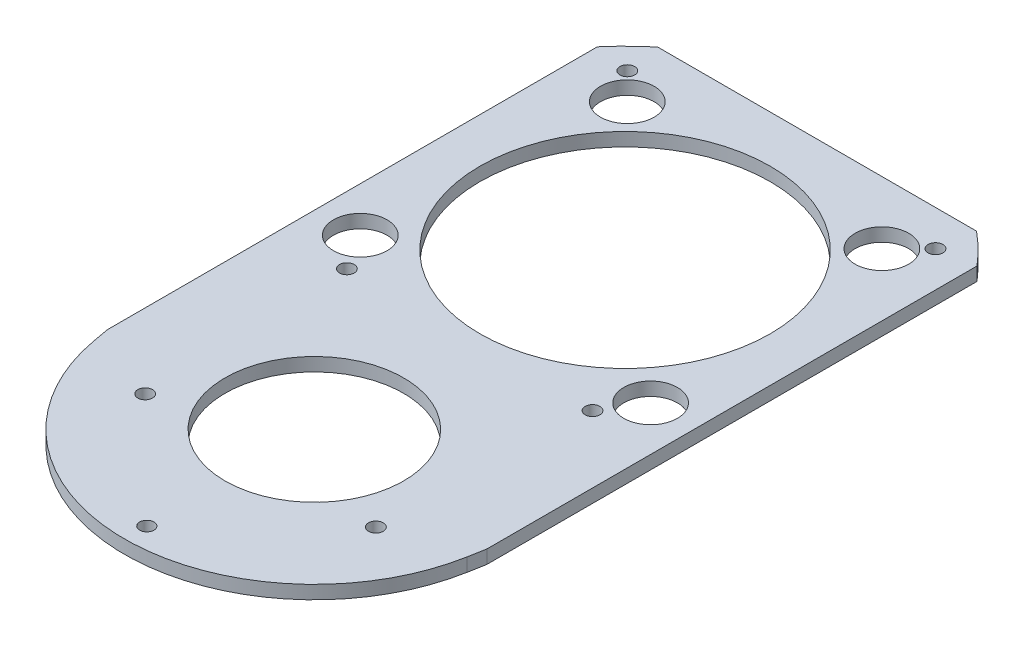
ISO-10303-21;
HEADER;
FILE_DESCRIPTION(('STEP AP214'),'2;1');
FILE_NAME('part.step','',(''),(''),'','','');
FILE_SCHEMA(('AUTOMOTIVE_DESIGN { 1 0 10303 214 1 1 1 1 }'));
ENDSEC;
DATA;
#1=APPLICATION_CONTEXT('core data for automotive mechanical design processes');
#2=APPLICATION_PROTOCOL_DEFINITION('international standard','automotive_design',2000,#1);
#3=PRODUCT_CONTEXT('',#1,'mechanical');
#4=PRODUCT('Part','Part','',(#3));
#5=PRODUCT_RELATED_PRODUCT_CATEGORY('part','',(#4));
#6=PRODUCT_DEFINITION_FORMATION('','',#4);
#7=PRODUCT_DEFINITION_CONTEXT('part definition',#1,'design');
#8=PRODUCT_DEFINITION('design','',#6,#7);
#9=PRODUCT_DEFINITION_SHAPE('','',#8);
#10=(LENGTH_UNIT() NAMED_UNIT(*) SI_UNIT(.MILLI.,.METRE.));
#11=(NAMED_UNIT(*) PLANE_ANGLE_UNIT() SI_UNIT($,.RADIAN.));
#12=(NAMED_UNIT(*) SI_UNIT($,.STERADIAN.) SOLID_ANGLE_UNIT());
#13=UNCERTAINTY_MEASURE_WITH_UNIT(LENGTH_MEASURE(1.E-05),#10,'distance_accuracy_value','');
#14=(GEOMETRIC_REPRESENTATION_CONTEXT(3) GLOBAL_UNCERTAINTY_ASSIGNED_CONTEXT((#13)) GLOBAL_UNIT_ASSIGNED_CONTEXT((#10,
#11,#12)) REPRESENTATION_CONTEXT('',''));
#15=CARTESIAN_POINT('',(0.,0.,0.));
#16=DIRECTION('',(0.,0.,1.));
#17=DIRECTION('',(1.,0.,0.));
#18=AXIS2_PLACEMENT_3D('',#15,#16,#17);
#19=CARTESIAN_POINT('',(2.42899334291316E-13,3.,69.5691343353414));
#20=DIRECTION('',(0.,1.,0.));
#21=DIRECTION('',(0.,0.,1.));
#22=AXIS2_PLACEMENT_3D('',#19,#20,#21);
#23=PLANE('',#22);
#24=CARTESIAN_POINT('',(32.5,3.,26.7845671676708));
#25=DIRECTION('',(0.,1.,0.));
#26=DIRECTION('',(0.,0.,1.));
#27=AXIS2_PLACEMENT_3D('',#24,#25,#26);
#28=CIRCLE('',#27,6.00000000000001);
#29=CARTESIAN_POINT('',(32.5,3.,32.7845671676708));
#30=VERTEX_POINT('',#29);
#31=EDGE_CURVE('E301',#30,#30,#28,.T.);
#32=ORIENTED_EDGE('',*,*,#31,.F.);
#33=EDGE_LOOP('',(#32));
#34=FACE_BOUND('',#33,.T.);
#35=CARTESIAN_POINT('',(-32.5,3.,26.7845671676708));
#36=DIRECTION('',(0.,1.,0.));
#37=DIRECTION('',(0.,0.,1.));
#38=AXIS2_PLACEMENT_3D('',#35,#36,#37);
#39=CIRCLE('',#38,6.00000000000001);
#40=CARTESIAN_POINT('',(-32.5,3.,32.7845671676708));
#41=VERTEX_POINT('',#40);
#42=EDGE_CURVE('E309',#41,#41,#39,.T.);
#43=ORIENTED_EDGE('',*,*,#42,.F.);
#44=EDGE_LOOP('',(#43));
#45=FACE_BOUND('',#44,.T.);
#46=CARTESIAN_POINT('',(-28.5,3.,-29.));
#47=DIRECTION('',(0.,1.,0.));
#48=DIRECTION('',(0.,0.,1.));
#49=AXIS2_PLACEMENT_3D('',#46,#47,#48);
#50=CIRCLE('',#49,6.);
#51=CARTESIAN_POINT('',(-28.5,3.,-23.));
#52=VERTEX_POINT('',#51);
#53=EDGE_CURVE('E305',#52,#52,#50,.T.);
#54=ORIENTED_EDGE('',*,*,#53,.F.);
#55=EDGE_LOOP('',(#54));
#56=FACE_BOUND('',#55,.T.);
#57=CARTESIAN_POINT('',(28.5,3.,-29.));
#58=DIRECTION('',(0.,1.,0.));
#59=DIRECTION('',(0.,0.,1.));
#60=AXIS2_PLACEMENT_3D('',#57,#58,#59);
#61=CIRCLE('',#60,6.);
#62=CARTESIAN_POINT('',(28.5,3.,-23.));
#63=VERTEX_POINT('',#62);
#64=EDGE_CURVE('E323',#63,#63,#61,.T.);
#65=ORIENTED_EDGE('',*,*,#64,.F.);
#66=EDGE_LOOP('',(#65));
#67=FACE_BOUND('',#66,.T.);
#68=CARTESIAN_POINT('',(-27.4999999999998,3.,34.7845671676708));
#69=DIRECTION('',(0.,1.,0.));
#70=DIRECTION('',(0.,0.,1.));
#71=AXIS2_PLACEMENT_3D('',#68,#69,#70);
#72=CIRCLE('',#71,1.65);
#73=CARTESIAN_POINT('',(-27.4999999999998,3.,36.4345671676708));
#74=VERTEX_POINT('',#73);
#75=EDGE_CURVE('E326',#74,#74,#72,.T.);
#76=ORIENTED_EDGE('',*,*,#75,.F.);
#77=EDGE_LOOP('',(#76));
#78=FACE_BOUND('',#77,.T.);
#79=CARTESIAN_POINT('',(-25.8297719305444,3.,81.6137547949512));
#80=DIRECTION('',(0.,1.,0.));
#81=DIRECTION('',(0.,0.,1.));
#82=AXIS2_PLACEMENT_3D('',#79,#80,#81);
#83=CIRCLE('',#82,1.65);
#84=CARTESIAN_POINT('',(-25.8297719305444,3.,83.2637547949512));
#85=VERTEX_POINT('',#84);
#86=EDGE_CURVE('E330',#85,#85,#83,.T.);
#87=ORIENTED_EDGE('',*,*,#86,.F.);
#88=EDGE_LOOP('',(#87));
#89=FACE_BOUND('',#88,.T.);
#90=CARTESIAN_POINT('',(25.8297719305441,3.,81.6137547949512));
#91=DIRECTION('',(0.,1.,0.));
#92=DIRECTION('',(0.,0.,1.));
#93=AXIS2_PLACEMENT_3D('',#90,#91,#92);
#94=CIRCLE('',#93,1.65);
#95=CARTESIAN_POINT('',(25.8297719305441,3.,83.2637547949512));
#96=VERTEX_POINT('',#95);
#97=EDGE_CURVE('E327',#96,#96,#94,.T.);
#98=ORIENTED_EDGE('',*,*,#97,.F.);
#99=EDGE_LOOP('',(#98));
#100=FACE_BOUND('',#99,.T.);
#101=CARTESIAN_POINT('',(27.4999999999998,3.,34.7845671676708));
#102=DIRECTION('',(0.,1.,0.));
#103=DIRECTION('',(0.,0.,1.));
#104=AXIS2_PLACEMENT_3D('',#101,#102,#103);
#105=CIRCLE('',#104,1.65);
#106=CARTESIAN_POINT('',(27.4999999999998,3.,36.4345671676708));
#107=VERTEX_POINT('',#106);
#108=EDGE_CURVE('E192',#107,#107,#105,.T.);
#109=ORIENTED_EDGE('',*,*,#108,.F.);
#110=EDGE_LOOP('',(#109));
#111=FACE_BOUND('',#110,.T.);
#112=CARTESIAN_POINT('',(34.5,3.,-35.));
#113=DIRECTION('',(0.,1.,0.));
#114=DIRECTION('',(0.,0.,1.));
#115=AXIS2_PLACEMENT_3D('',#112,#113,#114);
#116=CIRCLE('',#115,1.65);
#117=CARTESIAN_POINT('',(34.5,3.,-33.35));
#118=VERTEX_POINT('',#117);
#119=EDGE_CURVE('E174',#118,#118,#116,.T.);
#120=ORIENTED_EDGE('',*,*,#119,.F.);
#121=EDGE_LOOP('',(#120));
#122=FACE_BOUND('',#121,.T.);
#123=CARTESIAN_POINT('',(-34.5,3.,-35.));
#124=DIRECTION('',(0.,1.,0.));
#125=DIRECTION('',(0.,0.,1.));
#126=AXIS2_PLACEMENT_3D('',#123,#124,#125);
#127=CIRCLE('',#126,1.65);
#128=CARTESIAN_POINT('',(-34.5,3.,-33.35));
#129=VERTEX_POINT('',#128);
#130=EDGE_CURVE('E169',#129,#129,#127,.T.);
#131=ORIENTED_EDGE('',*,*,#130,.F.);
#132=EDGE_LOOP('',(#131));
#133=FACE_BOUND('',#132,.T.);
#134=CARTESIAN_POINT('',(0.,3.,107.069134335341));
#135=DIRECTION('',(0.,1.,0.));
#136=DIRECTION('',(0.,0.,1.));
#137=AXIS2_PLACEMENT_3D('',#134,#135,#136);
#138=CIRCLE('',#137,1.6);
#139=CARTESIAN_POINT('',(0.,3.,108.669134335341));
#140=VERTEX_POINT('',#139);
#141=EDGE_CURVE('E165',#140,#140,#138,.T.);
#142=ORIENTED_EDGE('',*,*,#141,.F.);
#143=EDGE_LOOP('',(#142));
#144=FACE_BOUND('',#143,.T.);
#145=CARTESIAN_POINT('',(0.,3.,0.));
#146=DIRECTION('',(0.,1.,0.));
#147=DIRECTION('',(0.,0.,1.));
#148=AXIS2_PLACEMENT_3D('',#145,#146,#147);
#149=CIRCLE('',#148,32.5);
#150=CARTESIAN_POINT('',(0.,3.,32.5));
#151=VERTEX_POINT('',#150);
#152=EDGE_CURVE('E138',#151,#151,#149,.T.);
#153=ORIENTED_EDGE('',*,*,#152,.F.);
#154=EDGE_LOOP('',(#153));
#155=FACE_BOUND('',#154,.T.);
#156=DIRECTION('',(0.,0.,1.));
#157=VECTOR('',#156,1.);
#158=CARTESIAN_POINT('',(-42.5,3.,-36.2891818967927));
#159=LINE('',#158,#157);
#160=CARTESIAN_POINT('',(-42.5,3.,-36.2891818967928));
#161=VERTEX_POINT('',#160);
#162=CARTESIAN_POINT('',(-42.5,3.,73.4119666647863));
#163=VERTEX_POINT('',#162);
#164=EDGE_CURVE('E149',#161,#163,#159,.T.);
#165=ORIENTED_EDGE('',*,*,#164,.T.);
#166=DIRECTION('',(0.179372671080308,0.,0.983781197660087));
#167=VECTOR('',#166,1.);
#168=CARTESIAN_POINT('',(-42.5,3.,73.4119666647863));
#169=LINE('',#168,#167);
#170=CARTESIAN_POINT('',(-41.8107009005537,3.,77.1924728562545));
#171=VERTEX_POINT('',#170);
#172=EDGE_CURVE('E97',#163,#171,#169,.T.);
#173=ORIENTED_EDGE('',*,*,#172,.T.);
#174=CARTESIAN_POINT('',(2.42899334291316E-13,3.,69.5691343353414));
#175=DIRECTION('',(0.,1.,0.));
#176=DIRECTION('',(0.,0.,1.));
#177=AXIS2_PLACEMENT_3D('',#174,#175,#176);
#178=CIRCLE('',#177,42.5);
#179=CARTESIAN_POINT('',(41.810700900554,3.,77.1924728562544));
#180=VERTEX_POINT('',#179);
#181=EDGE_CURVE('E208',#171,#180,#178,.T.);
#182=ORIENTED_EDGE('',*,*,#181,.T.);
#183=DIRECTION('',(0.179372671080303,0.,-0.983781197660088));
#184=VECTOR('',#183,1.);
#185=CARTESIAN_POINT('',(42.5,3.,73.4119666647863));
#186=LINE('',#185,#184);
#187=CARTESIAN_POINT('',(42.5,3.,73.4119666647863));
#188=VERTEX_POINT('',#187);
#189=EDGE_CURVE('E210',#180,#188,#186,.T.);
#190=ORIENTED_EDGE('',*,*,#189,.T.);
#191=DIRECTION('',(0.,0.,-1.));
#192=VECTOR('',#191,1.);
#193=CARTESIAN_POINT('',(42.5,3.,-36.2891818967928));
#194=LINE('',#193,#192);
#195=CARTESIAN_POINT('',(42.5,3.,-36.2891818967928));
#196=VERTEX_POINT('',#195);
#197=EDGE_CURVE('E116',#188,#196,#194,.T.);
#198=ORIENTED_EDGE('',*,*,#197,.T.);
#199=CARTESIAN_POINT('',(0.,3.,0.));
#200=DIRECTION('',(0.,1.,0.));
#201=DIRECTION('',(0.,0.,1.));
#202=AXIS2_PLACEMENT_3D('',#199,#200,#201);
#203=CIRCLE('',#202,55.8851923387449);
#204=CARTESIAN_POINT('',(35.6953039311687,3.,-43.));
#205=VERTEX_POINT('',#204);
#206=EDGE_CURVE('E110',#196,#205,#203,.T.);
#207=ORIENTED_EDGE('',*,*,#206,.T.);
#208=DIRECTION('',(-1.,0.,0.));
#209=VECTOR('',#208,1.);
#210=CARTESIAN_POINT('',(-35.6953039311688,3.,-43.));
#211=LINE('',#210,#209);
#212=CARTESIAN_POINT('',(-35.6953039311688,3.,-43.));
#213=VERTEX_POINT('',#212);
#214=EDGE_CURVE('E114',#205,#213,#211,.T.);
#215=ORIENTED_EDGE('',*,*,#214,.T.);
#216=CARTESIAN_POINT('',(0.,3.,0.));
#217=DIRECTION('',(0.,1.,0.));
#218=DIRECTION('',(0.,0.,1.));
#219=AXIS2_PLACEMENT_3D('',#216,#217,#218);
#220=CIRCLE('',#219,55.8851923387449);
#221=EDGE_CURVE('E54',#213,#161,#220,.T.);
#222=ORIENTED_EDGE('',*,*,#221,.T.);
#223=EDGE_LOOP('',(#165,#173,#182,#190,#198,#207,#215,#222));
#224=FACE_BOUND('',#223,.T.);
#225=CARTESIAN_POINT('',(2.42899334291316E-13,3.,69.5691343353414));
#226=DIRECTION('',(0.,1.,0.));
#227=DIRECTION('',(0.,0.,1.));
#228=AXIS2_PLACEMENT_3D('',#225,#226,#227);
#229=CIRCLE('',#228,20.);
#230=CARTESIAN_POINT('',(2.42899334291316E-13,3.,89.5691343353414));
#231=VERTEX_POINT('',#230);
#232=EDGE_CURVE('E196',#231,#231,#229,.T.);
#233=ORIENTED_EDGE('',*,*,#232,.F.);
#234=EDGE_LOOP('',(#233));
#235=FACE_BOUND('',#234,.T.);
#236=ADVANCED_FACE('F35',(#34,#45,#56,#67,#78,#89,#100,#111,#122,#133,#144,#155,#224,#235),#23,.T.);
#237=CARTESIAN_POINT('',(2.42899334291316E-13,0.,69.5691343353414));
#238=DIRECTION('',(0.,1.,0.));
#239=DIRECTION('',(0.,0.,1.));
#240=AXIS2_PLACEMENT_3D('',#237,#238,#239);
#241=PLANE('',#240);
#242=CARTESIAN_POINT('',(32.5,0.,26.7845671676708));
#243=DIRECTION('',(0.,-1.,0.));
#244=DIRECTION('',(0.,0.,-1.));
#245=AXIS2_PLACEMENT_3D('',#242,#243,#244);
#246=CIRCLE('',#245,6.00000000000001);
#247=CARTESIAN_POINT('',(32.5,0.,20.7845671676708));
#248=VERTEX_POINT('',#247);
#249=EDGE_CURVE('E304',#248,#248,#246,.T.);
#250=ORIENTED_EDGE('',*,*,#249,.F.);
#251=EDGE_LOOP('',(#250));
#252=FACE_BOUND('',#251,.T.);
#253=CARTESIAN_POINT('',(-32.5,0.,26.7845671676708));
#254=DIRECTION('',(0.,-1.,0.));
#255=DIRECTION('',(0.,0.,1.));
#256=AXIS2_PLACEMENT_3D('',#253,#254,#255);
#257=CIRCLE('',#256,6.00000000000001);
#258=CARTESIAN_POINT('',(-32.5,0.,32.7845671676708));
#259=VERTEX_POINT('',#258);
#260=EDGE_CURVE('E306',#259,#259,#257,.T.);
#261=ORIENTED_EDGE('',*,*,#260,.F.);
#262=EDGE_LOOP('',(#261));
#263=FACE_BOUND('',#262,.T.);
#264=CARTESIAN_POINT('',(-28.5,0.,-29.));
#265=DIRECTION('',(0.,-1.,0.));
#266=DIRECTION('',(0.,0.,1.));
#267=AXIS2_PLACEMENT_3D('',#264,#265,#266);
#268=CIRCLE('',#267,6.);
#269=CARTESIAN_POINT('',(-28.5,0.,-23.));
#270=VERTEX_POINT('',#269);
#271=EDGE_CURVE('E312',#270,#270,#268,.T.);
#272=ORIENTED_EDGE('',*,*,#271,.F.);
#273=EDGE_LOOP('',(#272));
#274=FACE_BOUND('',#273,.T.);
#275=CARTESIAN_POINT('',(28.5,0.,-29.));
#276=DIRECTION('',(0.,-1.,0.));
#277=DIRECTION('',(0.,0.,-1.));
#278=AXIS2_PLACEMENT_3D('',#275,#276,#277);
#279=CIRCLE('',#278,6.);
#280=CARTESIAN_POINT('',(28.5,0.,-35.));
#281=VERTEX_POINT('',#280);
#282=EDGE_CURVE('E320',#281,#281,#279,.T.);
#283=ORIENTED_EDGE('',*,*,#282,.F.);
#284=EDGE_LOOP('',(#283));
#285=FACE_BOUND('',#284,.T.);
#286=CARTESIAN_POINT('',(-27.4999999999998,0.,34.7845671676708));
#287=DIRECTION('',(0.,1.,0.));
#288=DIRECTION('',(0.,0.,1.));
#289=AXIS2_PLACEMENT_3D('',#286,#287,#288);
#290=CIRCLE('',#289,1.65);
#291=CARTESIAN_POINT('',(-27.4999999999998,0.,36.4345671676708));
#292=VERTEX_POINT('',#291);
#293=EDGE_CURVE('E39',#292,#292,#290,.T.);
#294=ORIENTED_EDGE('',*,*,#293,.T.);
#295=EDGE_LOOP('',(#294));
#296=FACE_BOUND('',#295,.T.);
#297=CARTESIAN_POINT('',(-25.8297719305444,0.,81.6137547949512));
#298=DIRECTION('',(0.,1.,0.));
#299=DIRECTION('',(0.,0.,1.));
#300=AXIS2_PLACEMENT_3D('',#297,#298,#299);
#301=CIRCLE('',#300,1.65);
#302=CARTESIAN_POINT('',(-25.8297719305444,0.,83.2637547949512));
#303=VERTEX_POINT('',#302);
#304=EDGE_CURVE('E179',#303,#303,#301,.T.);
#305=ORIENTED_EDGE('',*,*,#304,.T.);
#306=EDGE_LOOP('',(#305));
#307=FACE_BOUND('',#306,.T.);
#308=CARTESIAN_POINT('',(25.8297719305441,0.,81.6137547949512));
#309=DIRECTION('',(0.,1.,0.));
#310=DIRECTION('',(0.,0.,1.));
#311=AXIS2_PLACEMENT_3D('',#308,#309,#310);
#312=CIRCLE('',#311,1.65);
#313=CARTESIAN_POINT('',(25.8297719305441,0.,83.2637547949512));
#314=VERTEX_POINT('',#313);
#315=EDGE_CURVE('E177',#314,#314,#312,.T.);
#316=ORIENTED_EDGE('',*,*,#315,.T.);
#317=EDGE_LOOP('',(#316));
#318=FACE_BOUND('',#317,.T.);
#319=CARTESIAN_POINT('',(27.4999999999998,0.,34.7845671676708));
#320=DIRECTION('',(0.,1.,0.));
#321=DIRECTION('',(0.,0.,1.));
#322=AXIS2_PLACEMENT_3D('',#319,#320,#321);
#323=CIRCLE('',#322,1.65);
#324=CARTESIAN_POINT('',(27.4999999999998,0.,36.4345671676708));
#325=VERTEX_POINT('',#324);
#326=EDGE_CURVE('E173',#325,#325,#323,.T.);
#327=ORIENTED_EDGE('',*,*,#326,.T.);
#328=EDGE_LOOP('',(#327));
#329=FACE_BOUND('',#328,.T.);
#330=CARTESIAN_POINT('',(34.5,0.,-35.));
#331=DIRECTION('',(0.,1.,0.));
#332=DIRECTION('',(0.,0.,1.));
#333=AXIS2_PLACEMENT_3D('',#330,#331,#332);
#334=CIRCLE('',#333,1.65);
#335=CARTESIAN_POINT('',(34.5,0.,-33.35));
#336=VERTEX_POINT('',#335);
#337=EDGE_CURVE('E170',#336,#336,#334,.T.);
#338=ORIENTED_EDGE('',*,*,#337,.T.);
#339=EDGE_LOOP('',(#338));
#340=FACE_BOUND('',#339,.T.);
#341=CARTESIAN_POINT('',(-34.5,0.,-35.));
#342=DIRECTION('',(0.,1.,0.));
#343=DIRECTION('',(0.,0.,1.));
#344=AXIS2_PLACEMENT_3D('',#341,#342,#343);
#345=CIRCLE('',#344,1.65);
#346=CARTESIAN_POINT('',(-34.5,0.,-33.35));
#347=VERTEX_POINT('',#346);
#348=EDGE_CURVE('E166',#347,#347,#345,.T.);
#349=ORIENTED_EDGE('',*,*,#348,.T.);
#350=EDGE_LOOP('',(#349));
#351=FACE_BOUND('',#350,.T.);
#352=CARTESIAN_POINT('',(0.,0.,107.069134335341));
#353=DIRECTION('',(0.,1.,0.));
#354=DIRECTION('',(0.,0.,1.));
#355=AXIS2_PLACEMENT_3D('',#352,#353,#354);
#356=CIRCLE('',#355,1.6);
#357=CARTESIAN_POINT('',(0.,0.,108.669134335341));
#358=VERTEX_POINT('',#357);
#359=EDGE_CURVE('E161',#358,#358,#356,.T.);
#360=ORIENTED_EDGE('',*,*,#359,.T.);
#361=EDGE_LOOP('',(#360));
#362=FACE_BOUND('',#361,.T.);
#363=DIRECTION('',(0.,0.,1.));
#364=VECTOR('',#363,1.);
#365=CARTESIAN_POINT('',(-42.5,0.,-36.2891818967927));
#366=LINE('',#365,#364);
#367=CARTESIAN_POINT('',(-42.5,0.,-36.2891818967928));
#368=VERTEX_POINT('',#367);
#369=CARTESIAN_POINT('',(-42.5,0.,73.4119666647863));
#370=VERTEX_POINT('',#369);
#371=EDGE_CURVE('E134',#368,#370,#366,.T.);
#372=ORIENTED_EDGE('',*,*,#371,.F.);
#373=CARTESIAN_POINT('',(0.,0.,0.));
#374=DIRECTION('',(0.,1.,0.));
#375=DIRECTION('',(0.,0.,1.));
#376=AXIS2_PLACEMENT_3D('',#373,#374,#375);
#377=CIRCLE('',#376,55.8851923387449);
#378=CARTESIAN_POINT('',(-35.6953039311688,0.,-43.));
#379=VERTEX_POINT('',#378);
#380=EDGE_CURVE('E89',#379,#368,#377,.T.);
#381=ORIENTED_EDGE('',*,*,#380,.F.);
#382=DIRECTION('',(-1.,0.,0.));
#383=VECTOR('',#382,1.);
#384=CARTESIAN_POINT('',(-35.6953039311688,0.,-43.));
#385=LINE('',#384,#383);
#386=CARTESIAN_POINT('',(35.6953039311687,0.,-43.));
#387=VERTEX_POINT('',#386);
#388=EDGE_CURVE('E83',#387,#379,#385,.T.);
#389=ORIENTED_EDGE('',*,*,#388,.F.);
#390=CARTESIAN_POINT('',(0.,0.,0.));
#391=DIRECTION('',(0.,1.,0.));
#392=DIRECTION('',(0.,0.,1.));
#393=AXIS2_PLACEMENT_3D('',#390,#391,#392);
#394=CIRCLE('',#393,55.8851923387449);
#395=CARTESIAN_POINT('',(42.5,0.,-36.2891818967928));
#396=VERTEX_POINT('',#395);
#397=EDGE_CURVE('E124',#396,#387,#394,.T.);
#398=ORIENTED_EDGE('',*,*,#397,.F.);
#399=DIRECTION('',(0.,0.,-1.));
#400=VECTOR('',#399,1.);
#401=CARTESIAN_POINT('',(42.5,0.,-36.2891818967928));
#402=LINE('',#401,#400);
#403=CARTESIAN_POINT('',(42.5,0.,73.4119666647863));
#404=VERTEX_POINT('',#403);
#405=EDGE_CURVE('E144',#404,#396,#402,.T.);
#406=ORIENTED_EDGE('',*,*,#405,.F.);
#407=DIRECTION('',(0.179372671080303,0.,-0.983781197660088));
#408=VECTOR('',#407,1.);
#409=CARTESIAN_POINT('',(42.5,0.,73.4119666647863));
#410=LINE('',#409,#408);
#411=CARTESIAN_POINT('',(41.810700900554,0.,77.1924728562544));
#412=VERTEX_POINT('',#411);
#413=EDGE_CURVE('E142',#412,#404,#410,.T.);
#414=ORIENTED_EDGE('',*,*,#413,.F.);
#415=CARTESIAN_POINT('',(2.42899334291316E-13,0.,69.5691343353414));
#416=DIRECTION('',(0.,1.,0.));
#417=DIRECTION('',(0.,0.,1.));
#418=AXIS2_PLACEMENT_3D('',#415,#416,#417);
#419=CIRCLE('',#418,42.5);
#420=CARTESIAN_POINT('',(-41.8107009005537,0.,77.1924728562545));
#421=VERTEX_POINT('',#420);
#422=EDGE_CURVE('E140',#421,#412,#419,.T.);
#423=ORIENTED_EDGE('',*,*,#422,.F.);
#424=DIRECTION('',(0.179372671080308,0.,0.983781197660087));
#425=VECTOR('',#424,1.);
#426=CARTESIAN_POINT('',(-42.5,0.,73.4119666647863));
#427=LINE('',#426,#425);
#428=EDGE_CURVE('E137',#370,#421,#427,.T.);
#429=ORIENTED_EDGE('',*,*,#428,.F.);
#430=EDGE_LOOP('',(#372,#381,#389,#398,#406,#414,#423,#429));
#431=FACE_BOUND('',#430,.T.);
#432=CARTESIAN_POINT('',(0.,0.,0.));
#433=DIRECTION('',(0.,1.,0.));
#434=DIRECTION('',(0.,0.,1.));
#435=AXIS2_PLACEMENT_3D('',#432,#433,#434);
#436=CIRCLE('',#435,32.5);
#437=CARTESIAN_POINT('',(0.,0.,32.5));
#438=VERTEX_POINT('',#437);
#439=EDGE_CURVE('E199',#438,#438,#436,.T.);
#440=ORIENTED_EDGE('',*,*,#439,.T.);
#441=EDGE_LOOP('',(#440));
#442=FACE_BOUND('',#441,.T.);
#443=CARTESIAN_POINT('',(2.42899334291316E-13,0.,69.5691343353414));
#444=DIRECTION('',(0.,1.,0.));
#445=DIRECTION('',(0.,0.,1.));
#446=AXIS2_PLACEMENT_3D('',#443,#444,#445);
#447=CIRCLE('',#446,20.);
#448=CARTESIAN_POINT('',(2.42899334291316E-13,0.,89.5691343353414));
#449=VERTEX_POINT('',#448);
#450=EDGE_CURVE('E164',#449,#449,#447,.T.);
#451=ORIENTED_EDGE('',*,*,#450,.T.);
#452=EDGE_LOOP('',(#451));
#453=FACE_BOUND('',#452,.T.);
#454=ADVANCED_FACE('F223',(#252,#263,#274,#285,#296,#307,#318,#329,#340,#351,#362,#431,#442,
#453),#241,.F.);
#455=CARTESIAN_POINT('',(-42.5,3.,-36.2891818967927));
#456=DIRECTION('',(1.,0.,0.));
#457=DIRECTION('',(0.,0.,-1.));
#458=AXIS2_PLACEMENT_3D('',#455,#456,#457);
#459=PLANE('',#458);
#460=ORIENTED_EDGE('',*,*,#371,.T.);
#461=DIRECTION('',(0.,-1.,0.));
#462=VECTOR('',#461,1.);
#463=CARTESIAN_POINT('',(-42.5,3.,73.4119666647863));
#464=LINE('',#463,#462);
#465=EDGE_CURVE('E11',#163,#370,#464,.T.);
#466=ORIENTED_EDGE('',*,*,#465,.F.);
#467=ORIENTED_EDGE('',*,*,#164,.F.);
#468=DIRECTION('',(0.,-1.,0.));
#469=VECTOR('',#468,1.);
#470=CARTESIAN_POINT('',(-42.5,3.,-36.2891818967928));
#471=LINE('',#470,#469);
#472=EDGE_CURVE('E130',#161,#368,#471,.T.);
#473=ORIENTED_EDGE('',*,*,#472,.T.);
#474=EDGE_LOOP('',(#460,#466,#467,#473));
#475=FACE_BOUND('',#474,.T.);
#476=ADVANCED_FACE('F37',(#475),#459,.F.);
#477=CARTESIAN_POINT('',(-42.5,3.,73.4119666647863));
#478=DIRECTION('',(0.983781197660087,0.,-0.179372671080308));
#479=DIRECTION('',(-0.179372671080308,0.,-0.983781197660087));
#480=AXIS2_PLACEMENT_3D('',#477,#478,#479);
#481=PLANE('',#480);
#482=ORIENTED_EDGE('',*,*,#428,.T.);
#483=DIRECTION('',(0.,-1.,0.));
#484=VECTOR('',#483,1.);
#485=CARTESIAN_POINT('',(-41.8107009005537,3.,77.1924728562545));
#486=LINE('',#485,#484);
#487=EDGE_CURVE('E45',#171,#421,#486,.T.);
#488=ORIENTED_EDGE('',*,*,#487,.F.);
#489=ORIENTED_EDGE('',*,*,#172,.F.);
#490=ORIENTED_EDGE('',*,*,#465,.T.);
#491=EDGE_LOOP('',(#482,#488,#489,#490));
#492=FACE_BOUND('',#491,.T.);
#493=ADVANCED_FACE('F480',(#492),#481,.F.);
#494=CARTESIAN_POINT('',(2.42899334291316E-13,3.,69.5691343353414));
#495=DIRECTION('',(0.,-1.,0.));
#496=DIRECTION('',(0.,0.,-1.));
#497=AXIS2_PLACEMENT_3D('',#494,#495,#496);
#498=CYLINDRICAL_SURFACE('',#497,42.5);
#499=ORIENTED_EDGE('',*,*,#422,.T.);
#500=DIRECTION('',(0.,-1.,0.));
#501=VECTOR('',#500,1.);
#502=CARTESIAN_POINT('',(41.810700900554,3.,77.1924728562544));
#503=LINE('',#502,#501);
#504=EDGE_CURVE('E156',#180,#412,#503,.T.);
#505=ORIENTED_EDGE('',*,*,#504,.F.);
#506=ORIENTED_EDGE('',*,*,#181,.F.);
#507=ORIENTED_EDGE('',*,*,#487,.T.);
#508=EDGE_LOOP('',(#499,#505,#506,#507));
#509=FACE_BOUND('',#508,.T.);
#510=ADVANCED_FACE('F471',(#509),#498,.T.);
#511=CARTESIAN_POINT('',(42.5,3.,73.4119666647863));
#512=DIRECTION('',(-0.983781197660088,0.,-0.179372671080303));
#513=DIRECTION('',(-0.179372671080303,0.,0.983781197660088));
#514=AXIS2_PLACEMENT_3D('',#511,#512,#513);
#515=PLANE('',#514);
#516=ORIENTED_EDGE('',*,*,#413,.T.);
#517=DIRECTION('',(0.,-1.,0.));
#518=VECTOR('',#517,1.);
#519=CARTESIAN_POINT('',(42.5,3.,73.4119666647863));
#520=LINE('',#519,#518);
#521=EDGE_CURVE('E153',#188,#404,#520,.T.);
#522=ORIENTED_EDGE('',*,*,#521,.F.);
#523=ORIENTED_EDGE('',*,*,#189,.F.);
#524=ORIENTED_EDGE('',*,*,#504,.T.);
#525=EDGE_LOOP('',(#516,#522,#523,#524));
#526=FACE_BOUND('',#525,.T.);
#527=ADVANCED_FACE('F216',(#526),#515,.F.);
#528=CARTESIAN_POINT('',(42.5,3.,-36.2891818967928));
#529=DIRECTION('',(-1.,0.,0.));
#530=DIRECTION('',(0.,0.,1.));
#531=AXIS2_PLACEMENT_3D('',#528,#529,#530);
#532=PLANE('',#531);
#533=ORIENTED_EDGE('',*,*,#405,.T.);
#534=DIRECTION('',(0.,-1.,0.));
#535=VECTOR('',#534,1.);
#536=CARTESIAN_POINT('',(42.5,3.,-36.2891818967928));
#537=LINE('',#536,#535);
#538=EDGE_CURVE('E125',#196,#396,#537,.T.);
#539=ORIENTED_EDGE('',*,*,#538,.F.);
#540=ORIENTED_EDGE('',*,*,#197,.F.);
#541=ORIENTED_EDGE('',*,*,#521,.T.);
#542=EDGE_LOOP('',(#533,#539,#540,#541));
#543=FACE_BOUND('',#542,.T.);
#544=ADVANCED_FACE('F220',(#543),#532,.F.);
#545=CARTESIAN_POINT('',(0.,3.,0.));
#546=DIRECTION('',(0.,-1.,0.));
#547=DIRECTION('',(0.,0.,-1.));
#548=AXIS2_PLACEMENT_3D('',#545,#546,#547);
#549=CYLINDRICAL_SURFACE('',#548,55.8851923387449);
#550=ORIENTED_EDGE('',*,*,#397,.T.);
#551=DIRECTION('',(0.,-1.,0.));
#552=VECTOR('',#551,1.);
#553=CARTESIAN_POINT('',(35.6953039311687,3.,-43.));
#554=LINE('',#553,#552);
#555=EDGE_CURVE('E121',#205,#387,#554,.T.);
#556=ORIENTED_EDGE('',*,*,#555,.F.);
#557=ORIENTED_EDGE('',*,*,#206,.F.);
#558=ORIENTED_EDGE('',*,*,#538,.T.);
#559=EDGE_LOOP('',(#550,#556,#557,#558));
#560=FACE_BOUND('',#559,.T.);
#561=ADVANCED_FACE('F122',(#560),#549,.T.);
#562=CARTESIAN_POINT('',(-35.6953039311688,3.,-43.));
#563=DIRECTION('',(0.,0.,1.));
#564=DIRECTION('',(1.,0.,0.));
#565=AXIS2_PLACEMENT_3D('',#562,#563,#564);
#566=PLANE('',#565);
#567=ORIENTED_EDGE('',*,*,#388,.T.);
#568=DIRECTION('',(0.,-1.,0.));
#569=VECTOR('',#568,1.);
#570=CARTESIAN_POINT('',(-35.6953039311688,3.,-43.));
#571=LINE('',#570,#569);
#572=EDGE_CURVE('E126',#213,#379,#571,.T.);
#573=ORIENTED_EDGE('',*,*,#572,.F.);
#574=ORIENTED_EDGE('',*,*,#214,.F.);
#575=ORIENTED_EDGE('',*,*,#555,.T.);
#576=EDGE_LOOP('',(#567,#573,#574,#575));
#577=FACE_BOUND('',#576,.T.);
#578=ADVANCED_FACE('F128',(#577),#566,.F.);
#579=CARTESIAN_POINT('',(0.,3.,0.));
#580=DIRECTION('',(0.,-1.,0.));
#581=DIRECTION('',(0.,0.,-1.));
#582=AXIS2_PLACEMENT_3D('',#579,#580,#581);
#583=CYLINDRICAL_SURFACE('',#582,55.8851923387449);
#584=ORIENTED_EDGE('',*,*,#380,.T.);
#585=ORIENTED_EDGE('',*,*,#472,.F.);
#586=ORIENTED_EDGE('',*,*,#221,.F.);
#587=ORIENTED_EDGE('',*,*,#572,.T.);
#588=EDGE_LOOP('',(#584,#585,#586,#587));
#589=FACE_BOUND('',#588,.T.);
#590=ADVANCED_FACE('F229',(#589),#583,.T.);
#591=CARTESIAN_POINT('',(0.,3.,0.));
#592=DIRECTION('',(0.,-1.,0.));
#593=DIRECTION('',(0.,0.,-1.));
#594=AXIS2_PLACEMENT_3D('',#591,#592,#593);
#595=CYLINDRICAL_SURFACE('',#594,32.5);
#596=ORIENTED_EDGE('',*,*,#152,.T.);
#597=EDGE_LOOP('',(#596));
#598=FACE_BOUND('',#597,.T.);
#599=ORIENTED_EDGE('',*,*,#439,.F.);
#600=EDGE_LOOP('',(#599));
#601=FACE_BOUND('',#600,.T.);
#602=ADVANCED_FACE('F231',(#598,#601),#595,.F.);
#603=CARTESIAN_POINT('',(2.42899334291316E-13,3.,69.5691343353414));
#604=DIRECTION('',(0.,-1.,0.));
#605=DIRECTION('',(0.,0.,-1.));
#606=AXIS2_PLACEMENT_3D('',#603,#604,#605);
#607=CYLINDRICAL_SURFACE('',#606,20.);
#608=ORIENTED_EDGE('',*,*,#232,.T.);
#609=EDGE_LOOP('',(#608));
#610=FACE_BOUND('',#609,.T.);
#611=ORIENTED_EDGE('',*,*,#450,.F.);
#612=EDGE_LOOP('',(#611));
#613=FACE_BOUND('',#612,.T.);
#614=ADVANCED_FACE('F237',(#610,#613),#607,.F.);
#615=CARTESIAN_POINT('',(0.,-7.,107.069134335341));
#616=DIRECTION('',(0.,1.,0.));
#617=DIRECTION('',(0.,0.,1.));
#618=AXIS2_PLACEMENT_3D('',#615,#616,#617);
#619=CYLINDRICAL_SURFACE('',#618,1.6);
#620=ORIENTED_EDGE('',*,*,#141,.T.);
#621=EDGE_LOOP('',(#620));
#622=FACE_BOUND('',#621,.T.);
#623=ORIENTED_EDGE('',*,*,#359,.F.);
#624=EDGE_LOOP('',(#623));
#625=FACE_BOUND('',#624,.T.);
#626=ADVANCED_FACE('F254',(#622,#625),#619,.F.);
#627=CARTESIAN_POINT('',(-34.5,-7.,-35.));
#628=DIRECTION('',(0.,1.,0.));
#629=DIRECTION('',(0.,0.,1.));
#630=AXIS2_PLACEMENT_3D('',#627,#628,#629);
#631=CYLINDRICAL_SURFACE('',#630,1.65);
#632=ORIENTED_EDGE('',*,*,#130,.T.);
#633=EDGE_LOOP('',(#632));
#634=FACE_BOUND('',#633,.T.);
#635=ORIENTED_EDGE('',*,*,#348,.F.);
#636=EDGE_LOOP('',(#635));
#637=FACE_BOUND('',#636,.T.);
#638=ADVANCED_FACE('F258',(#634,#637),#631,.F.);
#639=CARTESIAN_POINT('',(34.5,-7.,-35.));
#640=DIRECTION('',(0.,1.,0.));
#641=DIRECTION('',(0.,0.,1.));
#642=AXIS2_PLACEMENT_3D('',#639,#640,#641);
#643=CYLINDRICAL_SURFACE('',#642,1.65);
#644=ORIENTED_EDGE('',*,*,#119,.T.);
#645=EDGE_LOOP('',(#644));
#646=FACE_BOUND('',#645,.T.);
#647=ORIENTED_EDGE('',*,*,#337,.F.);
#648=EDGE_LOOP('',(#647));
#649=FACE_BOUND('',#648,.T.);
#650=ADVANCED_FACE('F262',(#646,#649),#643,.F.);
#651=CARTESIAN_POINT('',(27.4999999999998,-7.,34.7845671676708));
#652=DIRECTION('',(0.,1.,0.));
#653=DIRECTION('',(0.,0.,1.));
#654=AXIS2_PLACEMENT_3D('',#651,#652,#653);
#655=CYLINDRICAL_SURFACE('',#654,1.65);
#656=ORIENTED_EDGE('',*,*,#108,.T.);
#657=EDGE_LOOP('',(#656));
#658=FACE_BOUND('',#657,.T.);
#659=ORIENTED_EDGE('',*,*,#326,.F.);
#660=EDGE_LOOP('',(#659));
#661=FACE_BOUND('',#660,.T.);
#662=ADVANCED_FACE('F263',(#658,#661),#655,.F.);
#663=CARTESIAN_POINT('',(25.8297719305441,-7.,81.6137547949512));
#664=DIRECTION('',(0.,1.,0.));
#665=DIRECTION('',(0.,0.,1.));
#666=AXIS2_PLACEMENT_3D('',#663,#664,#665);
#667=CYLINDRICAL_SURFACE('',#666,1.65);
#668=ORIENTED_EDGE('',*,*,#97,.T.);
#669=EDGE_LOOP('',(#668));
#670=FACE_BOUND('',#669,.T.);
#671=ORIENTED_EDGE('',*,*,#315,.F.);
#672=EDGE_LOOP('',(#671));
#673=FACE_BOUND('',#672,.T.);
#674=ADVANCED_FACE('F266',(#670,#673),#667,.F.);
#675=CARTESIAN_POINT('',(-25.8297719305444,-7.,81.6137547949512));
#676=DIRECTION('',(0.,1.,0.));
#677=DIRECTION('',(0.,0.,1.));
#678=AXIS2_PLACEMENT_3D('',#675,#676,#677);
#679=CYLINDRICAL_SURFACE('',#678,1.65);
#680=ORIENTED_EDGE('',*,*,#86,.T.);
#681=EDGE_LOOP('',(#680));
#682=FACE_BOUND('',#681,.T.);
#683=ORIENTED_EDGE('',*,*,#304,.F.);
#684=EDGE_LOOP('',(#683));
#685=FACE_BOUND('',#684,.T.);
#686=ADVANCED_FACE('F275',(#682,#685),#679,.F.);
#687=CARTESIAN_POINT('',(-27.4999999999998,-7.,34.7845671676708));
#688=DIRECTION('',(0.,1.,0.));
#689=DIRECTION('',(0.,0.,1.));
#690=AXIS2_PLACEMENT_3D('',#687,#688,#689);
#691=CYLINDRICAL_SURFACE('',#690,1.65);
#692=ORIENTED_EDGE('',*,*,#75,.T.);
#693=EDGE_LOOP('',(#692));
#694=FACE_BOUND('',#693,.T.);
#695=ORIENTED_EDGE('',*,*,#293,.F.);
#696=EDGE_LOOP('',(#695));
#697=FACE_BOUND('',#696,.T.);
#698=ADVANCED_FACE('F271',(#694,#697),#691,.F.);
#699=CARTESIAN_POINT('',(28.5,10.,-29.));
#700=DIRECTION('',(0.,-1.,0.));
#701=DIRECTION('',(0.,0.,-1.));
#702=AXIS2_PLACEMENT_3D('',#699,#700,#701);
#703=CYLINDRICAL_SURFACE('',#702,6.);
#704=ORIENTED_EDGE('',*,*,#64,.T.);
#705=EDGE_LOOP('',(#704));
#706=FACE_BOUND('',#705,.T.);
#707=ORIENTED_EDGE('',*,*,#282,.T.);
#708=EDGE_LOOP('',(#707));
#709=FACE_BOUND('',#708,.T.);
#710=ADVANCED_FACE('F274',(#706,#709),#703,.F.);
#711=CARTESIAN_POINT('',(-28.5,10.,-29.));
#712=DIRECTION('',(0.,-1.,0.));
#713=DIRECTION('',(0.,0.,-1.));
#714=AXIS2_PLACEMENT_3D('',#711,#712,#713);
#715=CYLINDRICAL_SURFACE('',#714,6.);
#716=ORIENTED_EDGE('',*,*,#53,.T.);
#717=EDGE_LOOP('',(#716));
#718=FACE_BOUND('',#717,.T.);
#719=ORIENTED_EDGE('',*,*,#271,.T.);
#720=EDGE_LOOP('',(#719));
#721=FACE_BOUND('',#720,.T.);
#722=ADVANCED_FACE('F285',(#718,#721),#715,.F.);
#723=CARTESIAN_POINT('',(-32.5,10.,26.7845671676708));
#724=DIRECTION('',(0.,-1.,0.));
#725=DIRECTION('',(0.,0.,-1.));
#726=AXIS2_PLACEMENT_3D('',#723,#724,#725);
#727=CYLINDRICAL_SURFACE('',#726,6.00000000000001);
#728=ORIENTED_EDGE('',*,*,#42,.T.);
#729=EDGE_LOOP('',(#728));
#730=FACE_BOUND('',#729,.T.);
#731=ORIENTED_EDGE('',*,*,#260,.T.);
#732=EDGE_LOOP('',(#731));
#733=FACE_BOUND('',#732,.T.);
#734=ADVANCED_FACE('F289',(#730,#733),#727,.F.);
#735=CARTESIAN_POINT('',(32.5,10.,26.7845671676708));
#736=DIRECTION('',(0.,-1.,0.));
#737=DIRECTION('',(0.,0.,-1.));
#738=AXIS2_PLACEMENT_3D('',#735,#736,#737);
#739=CYLINDRICAL_SURFACE('',#738,6.00000000000001);
#740=ORIENTED_EDGE('',*,*,#31,.T.);
#741=EDGE_LOOP('',(#740));
#742=FACE_BOUND('',#741,.T.);
#743=ORIENTED_EDGE('',*,*,#249,.T.);
#744=EDGE_LOOP('',(#743));
#745=FACE_BOUND('',#744,.T.);
#746=ADVANCED_FACE('F293',(#742,#745),#739,.F.);
#747=CLOSED_SHELL('',(#236,#454,#476,#493,#510,#527,#544,#561,#578,#590,#602,#614,#626,#638,
#650,#662,#674,#686,#698,#710,#722,#734,#746));
#748=MANIFOLD_SOLID_BREP('B2',#747);
#749=ADVANCED_BREP_SHAPE_REPRESENTATION('',(#18,#748),#14);
#750=SHAPE_DEFINITION_REPRESENTATION(#9,#749);
ENDSEC;
END-ISO-10303-21;
